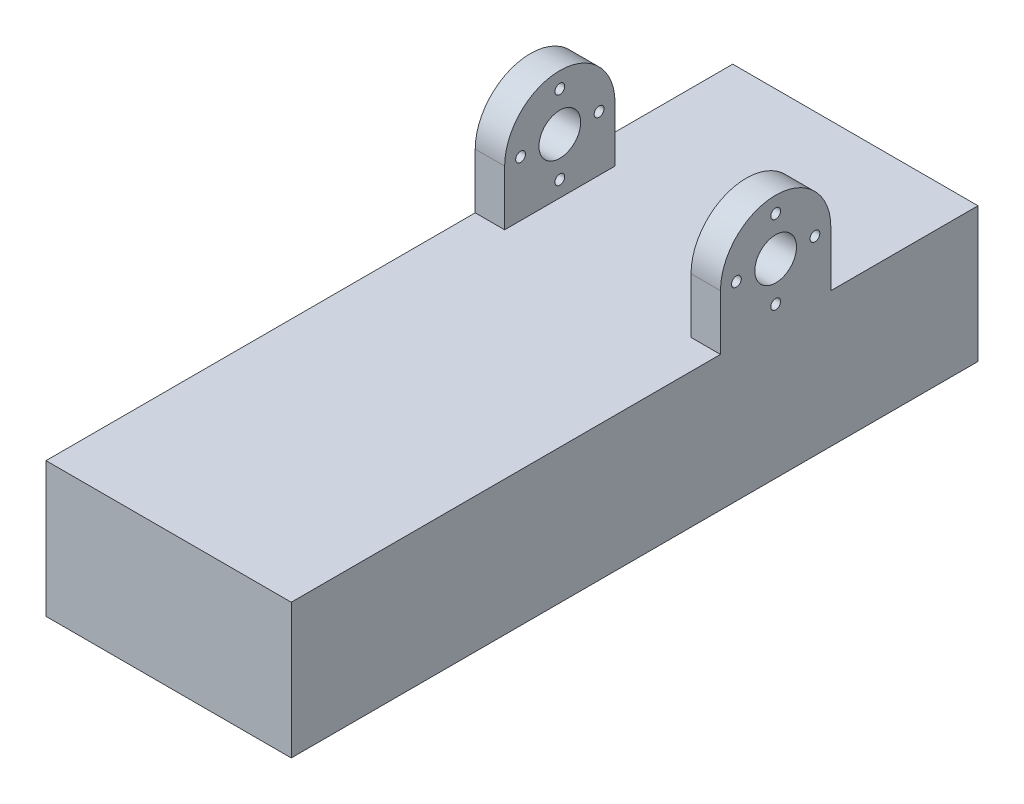
ISO-10303-21;
HEADER;
FILE_DESCRIPTION(('STEP AP214'),'2;1');
FILE_NAME('part.step','',(''),(''),'','','');
FILE_SCHEMA(('AUTOMOTIVE_DESIGN { 1 0 10303 214 1 1 1 1 }'));
ENDSEC;
DATA;
#1=APPLICATION_CONTEXT('core data for automotive mechanical design processes');
#2=APPLICATION_PROTOCOL_DEFINITION('international standard','automotive_design',2000,#1);
#3=PRODUCT_CONTEXT('',#1,'mechanical');
#4=PRODUCT('Part','Part','',(#3));
#5=PRODUCT_RELATED_PRODUCT_CATEGORY('part','',(#4));
#6=PRODUCT_DEFINITION_FORMATION('','',#4);
#7=PRODUCT_DEFINITION_CONTEXT('part definition',#1,'design');
#8=PRODUCT_DEFINITION('design','',#6,#7);
#9=PRODUCT_DEFINITION_SHAPE('','',#8);
#10=(LENGTH_UNIT() NAMED_UNIT(*) SI_UNIT(.MILLI.,.METRE.));
#11=(NAMED_UNIT(*) PLANE_ANGLE_UNIT() SI_UNIT($,.RADIAN.));
#12=(NAMED_UNIT(*) SI_UNIT($,.STERADIAN.) SOLID_ANGLE_UNIT());
#13=UNCERTAINTY_MEASURE_WITH_UNIT(LENGTH_MEASURE(1.E-05),#10,'distance_accuracy_value','');
#14=(GEOMETRIC_REPRESENTATION_CONTEXT(3) GLOBAL_UNCERTAINTY_ASSIGNED_CONTEXT((#13)) GLOBAL_UNIT_ASSIGNED_CONTEXT((#10,
#11,#12)) REPRESENTATION_CONTEXT('',''));
#15=CARTESIAN_POINT('',(0.,0.,0.));
#16=DIRECTION('',(0.,0.,1.));
#17=DIRECTION('',(1.,0.,0.));
#18=AXIS2_PLACEMENT_3D('',#15,#16,#17);
#19=CARTESIAN_POINT('',(-19.,0.,-55.));
#20=DIRECTION('',(-1.,0.,0.));
#21=DIRECTION('',(0.,-1.,0.));
#22=AXIS2_PLACEMENT_3D('',#19,#20,#21);
#23=PLANE('',#22);
#24=CARTESIAN_POINT('',(-19.,-12.75,-27.5));
#25=DIRECTION('',(-1.,0.,0.));
#26=DIRECTION('',(0.,-1.,0.));
#27=AXIS2_PLACEMENT_3D('',#24,#25,#26);
#28=CIRCLE('',#27,4.25);
#29=CARTESIAN_POINT('',(-19.,-17.,-27.5));
#30=VERTEX_POINT('',#29);
#31=EDGE_CURVE('E261',#30,#30,#28,.F.);
#32=ORIENTED_EDGE('',*,*,#31,.F.);
#33=EDGE_LOOP('',(#32));
#34=FACE_BOUND('',#33,.T.);
#35=CARTESIAN_POINT('',(-19.,-12.7499999999999,-35.5000000000001));
#36=DIRECTION('',(-1.,0.,0.));
#37=DIRECTION('',(0.,-1.,0.));
#38=AXIS2_PLACEMENT_3D('',#35,#36,#37);
#39=CIRCLE('',#38,1.00000000000001);
#40=CARTESIAN_POINT('',(-19.,-13.7499999999999,-35.5000000000001));
#41=VERTEX_POINT('',#40);
#42=EDGE_CURVE('E253',#41,#41,#39,.F.);
#43=ORIENTED_EDGE('',*,*,#42,.F.);
#44=EDGE_LOOP('',(#43));
#45=FACE_BOUND('',#44,.T.);
#46=CARTESIAN_POINT('',(-19.,-4.75000000000001,-27.5));
#47=DIRECTION('',(-1.,0.,0.));
#48=DIRECTION('',(0.,-1.,0.));
#49=AXIS2_PLACEMENT_3D('',#46,#47,#48);
#50=CIRCLE('',#49,1.);
#51=CARTESIAN_POINT('',(-19.,-5.75000000000001,-27.5));
#52=VERTEX_POINT('',#51);
#53=EDGE_CURVE('E249',#52,#52,#50,.F.);
#54=ORIENTED_EDGE('',*,*,#53,.F.);
#55=EDGE_LOOP('',(#54));
#56=FACE_BOUND('',#55,.T.);
#57=CARTESIAN_POINT('',(-19.,-20.75,-27.5000000000002));
#58=DIRECTION('',(-1.,0.,0.));
#59=DIRECTION('',(0.,-1.,0.));
#60=AXIS2_PLACEMENT_3D('',#57,#58,#59);
#61=CIRCLE('',#60,1.);
#62=CARTESIAN_POINT('',(-19.,-21.75,-27.5000000000002));
#63=VERTEX_POINT('',#62);
#64=EDGE_CURVE('E257',#63,#63,#61,.F.);
#65=ORIENTED_EDGE('',*,*,#64,.F.);
#66=EDGE_LOOP('',(#65));
#67=FACE_BOUND('',#66,.T.);
#68=CARTESIAN_POINT('',(-19.,-12.75,-19.5000000000001));
#69=DIRECTION('',(-1.,0.,0.));
#70=DIRECTION('',(0.,-1.,0.));
#71=AXIS2_PLACEMENT_3D('',#68,#69,#70);
#72=CIRCLE('',#71,1.);
#73=CARTESIAN_POINT('',(-19.,-13.75,-19.5000000000001));
#74=VERTEX_POINT('',#73);
#75=EDGE_CURVE('E265',#74,#74,#72,.F.);
#76=ORIENTED_EDGE('',*,*,#75,.F.);
#77=EDGE_LOOP('',(#76));
#78=FACE_BOUND('',#77,.T.);
#79=DIRECTION('',(0.,0.,1.));
#80=VECTOR('',#79,1.);
#81=CARTESIAN_POINT('',(-19.,-24.,-55.));
#82=LINE('',#81,#80);
#83=CARTESIAN_POINT('',(-19.,-24.,-38.75));
#84=VERTEX_POINT('',#83);
#85=CARTESIAN_POINT('',(-19.,-24.,-16.25));
#86=VERTEX_POINT('',#85);
#87=EDGE_CURVE('E182',#84,#86,#82,.T.);
#88=ORIENTED_EDGE('',*,*,#87,.F.);
#89=DIRECTION('',(0.,1.,0.));
#90=VECTOR('',#89,1.);
#91=CARTESIAN_POINT('',(-19.,0.,-38.75));
#92=LINE('',#91,#90);
#93=CARTESIAN_POINT('',(-19.,-12.75,-38.75));
#94=VERTEX_POINT('',#93);
#95=EDGE_CURVE('E227',#84,#94,#92,.T.);
#96=ORIENTED_EDGE('',*,*,#95,.T.);
#97=CARTESIAN_POINT('',(-19.,-12.75,-27.5));
#98=DIRECTION('',(-1.,0.,0.));
#99=DIRECTION('',(0.,-1.,0.));
#100=AXIS2_PLACEMENT_3D('',#97,#98,#99);
#101=CIRCLE('',#100,11.25);
#102=CARTESIAN_POINT('',(-19.,-12.75,-16.25));
#103=VERTEX_POINT('',#102);
#104=EDGE_CURVE('E246',#103,#94,#101,.T.);
#105=ORIENTED_EDGE('',*,*,#104,.F.);
#106=DIRECTION('',(0.,1.,0.));
#107=VECTOR('',#106,1.);
#108=CARTESIAN_POINT('',(-19.,0.,-16.25));
#109=LINE('',#108,#107);
#110=EDGE_CURVE('E243',#86,#103,#109,.T.);
#111=ORIENTED_EDGE('',*,*,#110,.F.);
#112=EDGE_LOOP('',(#88,#96,#105,#111));
#113=FACE_BOUND('',#112,.T.);
#114=ADVANCED_FACE('F47',(#34,#45,#56,#67,#78,#113),#23,.F.);
#115=CARTESIAN_POINT('',(19.,0.,-55.));
#116=DIRECTION('',(1.,0.,0.));
#117=DIRECTION('',(0.,1.,0.));
#118=AXIS2_PLACEMENT_3D('',#115,#116,#117);
#119=PLANE('',#118);
#120=CARTESIAN_POINT('',(19.,-12.75,-27.5));
#121=DIRECTION('',(1.,0.,0.));
#122=DIRECTION('',(0.,1.,0.));
#123=AXIS2_PLACEMENT_3D('',#120,#121,#122);
#124=CIRCLE('',#123,4.25);
#125=CARTESIAN_POINT('',(19.,-8.50000000000001,-27.5));
#126=VERTEX_POINT('',#125);
#127=EDGE_CURVE('E281',#126,#126,#124,.F.);
#128=ORIENTED_EDGE('',*,*,#127,.F.);
#129=EDGE_LOOP('',(#128));
#130=FACE_BOUND('',#129,.T.);
#131=CARTESIAN_POINT('',(19.,-12.7499999999999,-35.5000000000001));
#132=DIRECTION('',(1.,0.,0.));
#133=DIRECTION('',(0.,1.,0.));
#134=AXIS2_PLACEMENT_3D('',#131,#132,#133);
#135=CIRCLE('',#134,1.00000000000001);
#136=CARTESIAN_POINT('',(19.,-11.7499999999999,-35.5000000000001));
#137=VERTEX_POINT('',#136);
#138=EDGE_CURVE('E273',#137,#137,#135,.F.);
#139=ORIENTED_EDGE('',*,*,#138,.F.);
#140=EDGE_LOOP('',(#139));
#141=FACE_BOUND('',#140,.T.);
#142=CARTESIAN_POINT('',(19.,-4.75000000000001,-27.5));
#143=DIRECTION('',(1.,0.,0.));
#144=DIRECTION('',(0.,1.,0.));
#145=AXIS2_PLACEMENT_3D('',#142,#143,#144);
#146=CIRCLE('',#145,1.);
#147=CARTESIAN_POINT('',(19.,-3.75000000000001,-27.5));
#148=VERTEX_POINT('',#147);
#149=EDGE_CURVE('E269',#148,#148,#146,.F.);
#150=ORIENTED_EDGE('',*,*,#149,.F.);
#151=EDGE_LOOP('',(#150));
#152=FACE_BOUND('',#151,.T.);
#153=CARTESIAN_POINT('',(19.,-20.75,-27.5000000000002));
#154=DIRECTION('',(1.,0.,0.));
#155=DIRECTION('',(0.,1.,0.));
#156=AXIS2_PLACEMENT_3D('',#153,#154,#155);
#157=CIRCLE('',#156,1.);
#158=CARTESIAN_POINT('',(19.,-19.75,-27.5000000000002));
#159=VERTEX_POINT('',#158);
#160=EDGE_CURVE('E277',#159,#159,#157,.F.);
#161=ORIENTED_EDGE('',*,*,#160,.F.);
#162=EDGE_LOOP('',(#161));
#163=FACE_BOUND('',#162,.T.);
#164=CARTESIAN_POINT('',(19.,-12.75,-19.5000000000001));
#165=DIRECTION('',(1.,0.,0.));
#166=DIRECTION('',(0.,1.,0.));
#167=AXIS2_PLACEMENT_3D('',#164,#165,#166);
#168=CIRCLE('',#167,1.);
#169=CARTESIAN_POINT('',(19.,-11.75,-19.5000000000001));
#170=VERTEX_POINT('',#169);
#171=EDGE_CURVE('E285',#170,#170,#168,.F.);
#172=ORIENTED_EDGE('',*,*,#171,.F.);
#173=EDGE_LOOP('',(#172));
#174=FACE_BOUND('',#173,.T.);
#175=DIRECTION('',(0.,0.,-1.));
#176=VECTOR('',#175,1.);
#177=CARTESIAN_POINT('',(19.,-24.,-55.));
#178=LINE('',#177,#176);
#179=CARTESIAN_POINT('',(19.,-24.,-16.25));
#180=VERTEX_POINT('',#179);
#181=CARTESIAN_POINT('',(19.,-24.,-38.75));
#182=VERTEX_POINT('',#181);
#183=EDGE_CURVE('E192',#180,#182,#178,.T.);
#184=ORIENTED_EDGE('',*,*,#183,.F.);
#185=DIRECTION('',(0.,-1.,0.));
#186=VECTOR('',#185,1.);
#187=CARTESIAN_POINT('',(19.,0.,-16.25));
#188=LINE('',#187,#186);
#189=CARTESIAN_POINT('',(19.,-12.75,-16.25));
#190=VERTEX_POINT('',#189);
#191=EDGE_CURVE('E11',#190,#180,#188,.T.);
#192=ORIENTED_EDGE('',*,*,#191,.F.);
#193=CARTESIAN_POINT('',(19.,-12.75,-27.5));
#194=DIRECTION('',(1.,0.,0.));
#195=DIRECTION('',(0.,1.,0.));
#196=AXIS2_PLACEMENT_3D('',#193,#194,#195);
#197=CIRCLE('',#196,11.25);
#198=CARTESIAN_POINT('',(19.,-12.75,-38.75));
#199=VERTEX_POINT('',#198);
#200=EDGE_CURVE('E56',#199,#190,#197,.T.);
#201=ORIENTED_EDGE('',*,*,#200,.F.);
#202=DIRECTION('',(0.,-1.,0.));
#203=VECTOR('',#202,1.);
#204=CARTESIAN_POINT('',(19.,0.,-38.75));
#205=LINE('',#204,#203);
#206=EDGE_CURVE('E150',#199,#182,#205,.T.);
#207=ORIENTED_EDGE('',*,*,#206,.T.);
#208=EDGE_LOOP('',(#184,#192,#201,#207));
#209=FACE_BOUND('',#208,.T.);
#210=ADVANCED_FACE('F357',(#130,#141,#152,#163,#174,#209),#119,.F.);
#211=CARTESIAN_POINT('',(-25.,0.,-55.));
#212=DIRECTION('',(-1.,0.,0.));
#213=DIRECTION('',(0.,-1.,0.));
#214=AXIS2_PLACEMENT_3D('',#211,#212,#213);
#215=PLANE('',#214);
#216=DIRECTION('',(0.,0.,1.));
#217=VECTOR('',#216,1.);
#218=CARTESIAN_POINT('',(-25.,-24.,0.));
#219=LINE('',#218,#217);
#220=CARTESIAN_POINT('',(-25.0000000000001,-24.,-16.25));
#221=VERTEX_POINT('',#220);
#222=CARTESIAN_POINT('',(-25.,-24.,71.25));
#223=VERTEX_POINT('',#222);
#224=EDGE_CURVE('E292',#221,#223,#219,.T.);
#225=ORIENTED_EDGE('',*,*,#224,.F.);
#226=DIRECTION('',(0.,-1.,0.));
#227=VECTOR('',#226,1.);
#228=CARTESIAN_POINT('',(-25.0000000000001,0.,-16.25));
#229=LINE('',#228,#227);
#230=CARTESIAN_POINT('',(-25.0000000000001,-12.75,-16.25));
#231=VERTEX_POINT('',#230);
#232=EDGE_CURVE('E208',#231,#221,#229,.T.);
#233=ORIENTED_EDGE('',*,*,#232,.F.);
#234=CARTESIAN_POINT('',(-25.0000000000001,-12.75,-27.5));
#235=DIRECTION('',(1.,0.,0.));
#236=DIRECTION('',(0.,1.,0.));
#237=AXIS2_PLACEMENT_3D('',#234,#235,#236);
#238=CIRCLE('',#237,11.25);
#239=CARTESIAN_POINT('',(-25.0000000000001,-12.75,-38.75));
#240=VERTEX_POINT('',#239);
#241=EDGE_CURVE('E202',#240,#231,#238,.T.);
#242=ORIENTED_EDGE('',*,*,#241,.F.);
#243=DIRECTION('',(0.,-1.,0.));
#244=VECTOR('',#243,1.);
#245=CARTESIAN_POINT('',(-25.0000000000001,0.,-38.75));
#246=LINE('',#245,#244);
#247=CARTESIAN_POINT('',(-25.0000000000001,-24.,-38.75));
#248=VERTEX_POINT('',#247);
#249=EDGE_CURVE('E145',#240,#248,#246,.T.);
#250=ORIENTED_EDGE('',*,*,#249,.T.);
#251=DIRECTION('',(0.,0.,1.));
#252=VECTOR('',#251,1.);
#253=CARTESIAN_POINT('',(-25.,-24.,0.));
#254=LINE('',#253,#252);
#255=CARTESIAN_POINT('',(-25.,-24.,-68.75));
#256=VERTEX_POINT('',#255);
#257=EDGE_CURVE('E138',#256,#248,#254,.T.);
#258=ORIENTED_EDGE('',*,*,#257,.F.);
#259=DIRECTION('',(0.,-1.,0.));
#260=VECTOR('',#259,1.);
#261=CARTESIAN_POINT('',(-25.,0.,-68.75));
#262=LINE('',#261,#260);
#263=CARTESIAN_POINT('',(-25.,-51.5,-68.75));
#264=VERTEX_POINT('',#263);
#265=EDGE_CURVE('E142',#256,#264,#262,.T.);
#266=ORIENTED_EDGE('',*,*,#265,.T.);
#267=DIRECTION('',(0.,0.,-1.));
#268=VECTOR('',#267,1.);
#269=CARTESIAN_POINT('',(-25.0000000000001,-51.5,0.));
#270=LINE('',#269,#268);
#271=CARTESIAN_POINT('',(-25.,-51.5,71.25));
#272=VERTEX_POINT('',#271);
#273=EDGE_CURVE('E196',#272,#264,#270,.T.);
#274=ORIENTED_EDGE('',*,*,#273,.F.);
#275=DIRECTION('',(0.,-1.,0.));
#276=VECTOR('',#275,1.);
#277=CARTESIAN_POINT('',(-25.,0.,71.25));
#278=LINE('',#277,#276);
#279=EDGE_CURVE('E162',#223,#272,#278,.T.);
#280=ORIENTED_EDGE('',*,*,#279,.F.);
#281=EDGE_LOOP('',(#225,#233,#242,#250,#258,#266,#274,#280));
#282=FACE_BOUND('',#281,.T.);
#283=CARTESIAN_POINT('',(-25.,-12.75,-19.5000000000001));
#284=DIRECTION('',(1.,0.,0.));
#285=DIRECTION('',(0.,1.,0.));
#286=AXIS2_PLACEMENT_3D('',#283,#284,#285);
#287=CIRCLE('',#286,1.);
#288=CARTESIAN_POINT('',(-25.,-11.75,-19.5000000000001));
#289=VERTEX_POINT('',#288);
#290=EDGE_CURVE('E314',#289,#289,#287,.T.);
#291=ORIENTED_EDGE('',*,*,#290,.T.);
#292=EDGE_LOOP('',(#291));
#293=FACE_BOUND('',#292,.T.);
#294=CARTESIAN_POINT('',(-25.,-12.75,-27.5));
#295=DIRECTION('',(1.,0.,0.));
#296=DIRECTION('',(0.,1.,0.));
#297=AXIS2_PLACEMENT_3D('',#294,#295,#296);
#298=CIRCLE('',#297,4.25);
#299=CARTESIAN_POINT('',(-25.,-8.50000000000001,-27.5));
#300=VERTEX_POINT('',#299);
#301=EDGE_CURVE('E322',#300,#300,#298,.T.);
#302=ORIENTED_EDGE('',*,*,#301,.T.);
#303=EDGE_LOOP('',(#302));
#304=FACE_BOUND('',#303,.T.);
#305=CARTESIAN_POINT('',(-25.,-20.75,-27.5000000000002));
#306=DIRECTION('',(1.,0.,0.));
#307=DIRECTION('',(0.,1.,0.));
#308=AXIS2_PLACEMENT_3D('',#305,#306,#307);
#309=CIRCLE('',#308,1.);
#310=CARTESIAN_POINT('',(-25.,-19.75,-27.5000000000002));
#311=VERTEX_POINT('',#310);
#312=EDGE_CURVE('E330',#311,#311,#309,.T.);
#313=ORIENTED_EDGE('',*,*,#312,.T.);
#314=EDGE_LOOP('',(#313));
#315=FACE_BOUND('',#314,.T.);
#316=CARTESIAN_POINT('',(-25.,-12.7499999999999,-35.5000000000001));
#317=DIRECTION('',(1.,0.,0.));
#318=DIRECTION('',(0.,1.,0.));
#319=AXIS2_PLACEMENT_3D('',#316,#317,#318);
#320=CIRCLE('',#319,1.00000000000001);
#321=CARTESIAN_POINT('',(-25.,-11.7499999999999,-35.5000000000001));
#322=VERTEX_POINT('',#321);
#323=EDGE_CURVE('E293',#322,#322,#320,.T.);
#324=ORIENTED_EDGE('',*,*,#323,.T.);
#325=EDGE_LOOP('',(#324));
#326=FACE_BOUND('',#325,.T.);
#327=CARTESIAN_POINT('',(-25.,-4.75000000000001,-27.5));
#328=DIRECTION('',(1.,0.,0.));
#329=DIRECTION('',(0.,1.,0.));
#330=AXIS2_PLACEMENT_3D('',#327,#328,#329);
#331=CIRCLE('',#330,1.);
#332=CARTESIAN_POINT('',(-25.,-3.75000000000001,-27.5));
#333=VERTEX_POINT('',#332);
#334=EDGE_CURVE('E302',#333,#333,#331,.T.);
#335=ORIENTED_EDGE('',*,*,#334,.T.);
#336=EDGE_LOOP('',(#335));
#337=FACE_BOUND('',#336,.T.);
#338=ADVANCED_FACE('F49',(#282,#293,#304,#315,#326,#337),#215,.T.);
#339=CARTESIAN_POINT('',(25.,0.,-55.));
#340=DIRECTION('',(1.,0.,0.));
#341=DIRECTION('',(0.,1.,0.));
#342=AXIS2_PLACEMENT_3D('',#339,#340,#341);
#343=PLANE('',#342);
#344=DIRECTION('',(0.,0.,1.));
#345=VECTOR('',#344,1.);
#346=CARTESIAN_POINT('',(25.,-24.,0.));
#347=LINE('',#346,#345);
#348=CARTESIAN_POINT('',(25.,-24.,-68.75));
#349=VERTEX_POINT('',#348);
#350=CARTESIAN_POINT('',(25.,-24.,-38.75));
#351=VERTEX_POINT('',#350);
#352=EDGE_CURVE('E151',#349,#351,#347,.T.);
#353=ORIENTED_EDGE('',*,*,#352,.T.);
#354=DIRECTION('',(0.,-1.,0.));
#355=VECTOR('',#354,1.);
#356=CARTESIAN_POINT('',(25.,0.,-38.75));
#357=LINE('',#356,#355);
#358=CARTESIAN_POINT('',(25.,-12.75,-38.75));
#359=VERTEX_POINT('',#358);
#360=EDGE_CURVE('E216',#359,#351,#357,.T.);
#361=ORIENTED_EDGE('',*,*,#360,.F.);
#362=CARTESIAN_POINT('',(25.,-12.75,-27.5));
#363=DIRECTION('',(1.,0.,0.));
#364=DIRECTION('',(0.,1.,0.));
#365=AXIS2_PLACEMENT_3D('',#362,#363,#364);
#366=CIRCLE('',#365,11.25);
#367=CARTESIAN_POINT('',(25.,-12.75,-16.25));
#368=VERTEX_POINT('',#367);
#369=EDGE_CURVE('E199',#359,#368,#366,.T.);
#370=ORIENTED_EDGE('',*,*,#369,.T.);
#371=DIRECTION('',(0.,-1.,0.));
#372=VECTOR('',#371,1.);
#373=CARTESIAN_POINT('',(25.,0.,-16.25));
#374=LINE('',#373,#372);
#375=CARTESIAN_POINT('',(25.,-24.,-16.25));
#376=VERTEX_POINT('',#375);
#377=EDGE_CURVE('E205',#368,#376,#374,.T.);
#378=ORIENTED_EDGE('',*,*,#377,.T.);
#379=DIRECTION('',(0.,0.,1.));
#380=VECTOR('',#379,1.);
#381=CARTESIAN_POINT('',(25.,-24.,0.));
#382=LINE('',#381,#380);
#383=CARTESIAN_POINT('',(25.,-24.,71.25));
#384=VERTEX_POINT('',#383);
#385=EDGE_CURVE('E311',#376,#384,#382,.T.);
#386=ORIENTED_EDGE('',*,*,#385,.T.);
#387=DIRECTION('',(0.,-1.,0.));
#388=VECTOR('',#387,1.);
#389=CARTESIAN_POINT('',(25.,0.,71.25));
#390=LINE('',#389,#388);
#391=CARTESIAN_POINT('',(25.,-51.5,71.25));
#392=VERTEX_POINT('',#391);
#393=EDGE_CURVE('E168',#384,#392,#390,.T.);
#394=ORIENTED_EDGE('',*,*,#393,.T.);
#395=DIRECTION('',(0.,0.,-1.));
#396=VECTOR('',#395,1.);
#397=CARTESIAN_POINT('',(25.,-51.5,0.));
#398=LINE('',#397,#396);
#399=CARTESIAN_POINT('',(25.,-51.5,-68.75));
#400=VERTEX_POINT('',#399);
#401=EDGE_CURVE('E195',#392,#400,#398,.T.);
#402=ORIENTED_EDGE('',*,*,#401,.T.);
#403=DIRECTION('',(0.,-1.,0.));
#404=VECTOR('',#403,1.);
#405=CARTESIAN_POINT('',(25.,0.,-68.75));
#406=LINE('',#405,#404);
#407=EDGE_CURVE('E175',#349,#400,#406,.T.);
#408=ORIENTED_EDGE('',*,*,#407,.F.);
#409=EDGE_LOOP('',(#353,#361,#370,#378,#386,#394,#402,#408));
#410=FACE_BOUND('',#409,.T.);
#411=CARTESIAN_POINT('',(25.,-12.75,-19.5000000000001));
#412=DIRECTION('',(1.,0.,0.));
#413=DIRECTION('',(0.,1.,0.));
#414=AXIS2_PLACEMENT_3D('',#411,#412,#413);
#415=CIRCLE('',#414,1.);
#416=CARTESIAN_POINT('',(25.,-11.75,-19.5000000000001));
#417=VERTEX_POINT('',#416);
#418=EDGE_CURVE('E318',#417,#417,#415,.T.);
#419=ORIENTED_EDGE('',*,*,#418,.F.);
#420=EDGE_LOOP('',(#419));
#421=FACE_BOUND('',#420,.T.);
#422=CARTESIAN_POINT('',(25.,-12.75,-27.5));
#423=DIRECTION('',(1.,0.,0.));
#424=DIRECTION('',(0.,1.,0.));
#425=AXIS2_PLACEMENT_3D('',#422,#423,#424);
#426=CIRCLE('',#425,4.25);
#427=CARTESIAN_POINT('',(25.,-8.50000000000001,-27.5));
#428=VERTEX_POINT('',#427);
#429=EDGE_CURVE('E326',#428,#428,#426,.T.);
#430=ORIENTED_EDGE('',*,*,#429,.F.);
#431=EDGE_LOOP('',(#430));
#432=FACE_BOUND('',#431,.T.);
#433=CARTESIAN_POINT('',(25.,-20.75,-27.5000000000002));
#434=DIRECTION('',(1.,0.,0.));
#435=DIRECTION('',(0.,1.,0.));
#436=AXIS2_PLACEMENT_3D('',#433,#434,#435);
#437=CIRCLE('',#436,1.);
#438=CARTESIAN_POINT('',(25.,-19.75,-27.5000000000002));
#439=VERTEX_POINT('',#438);
#440=EDGE_CURVE('E297',#439,#439,#437,.T.);
#441=ORIENTED_EDGE('',*,*,#440,.F.);
#442=EDGE_LOOP('',(#441));
#443=FACE_BOUND('',#442,.T.);
#444=CARTESIAN_POINT('',(25.,-12.7499999999999,-35.5000000000001));
#445=DIRECTION('',(1.,0.,0.));
#446=DIRECTION('',(0.,1.,0.));
#447=AXIS2_PLACEMENT_3D('',#444,#445,#446);
#448=CIRCLE('',#447,1.00000000000001);
#449=CARTESIAN_POINT('',(25.,-11.7499999999999,-35.5000000000001));
#450=VERTEX_POINT('',#449);
#451=EDGE_CURVE('E298',#450,#450,#448,.T.);
#452=ORIENTED_EDGE('',*,*,#451,.F.);
#453=EDGE_LOOP('',(#452));
#454=FACE_BOUND('',#453,.T.);
#455=CARTESIAN_POINT('',(25.,-4.75000000000001,-27.5));
#456=DIRECTION('',(1.,0.,0.));
#457=DIRECTION('',(0.,1.,0.));
#458=AXIS2_PLACEMENT_3D('',#455,#456,#457);
#459=CIRCLE('',#458,1.);
#460=CARTESIAN_POINT('',(25.,-3.75,-27.5));
#461=VERTEX_POINT('',#460);
#462=EDGE_CURVE('E288',#461,#461,#459,.T.);
#463=ORIENTED_EDGE('',*,*,#462,.F.);
#464=EDGE_LOOP('',(#463));
#465=FACE_BOUND('',#464,.T.);
#466=ADVANCED_FACE('F353',(#410,#421,#432,#443,#454,#465),#343,.T.);
#467=CARTESIAN_POINT('',(-25.,-12.75,-19.5000000000001));
#468=DIRECTION('',(1.,0.,0.));
#469=DIRECTION('',(0.,1.,0.));
#470=AXIS2_PLACEMENT_3D('',#467,#468,#469);
#471=CYLINDRICAL_SURFACE('',#470,1.);
#472=ORIENTED_EDGE('',*,*,#171,.T.);
#473=EDGE_LOOP('',(#472));
#474=FACE_BOUND('',#473,.T.);
#475=ORIENTED_EDGE('',*,*,#418,.T.);
#476=EDGE_LOOP('',(#475));
#477=FACE_BOUND('',#476,.T.);
#478=ADVANCED_FACE('F417',(#474,#477),#471,.F.);
#479=CARTESIAN_POINT('',(-25.,-12.75,-27.5));
#480=DIRECTION('',(1.,0.,0.));
#481=DIRECTION('',(0.,1.,0.));
#482=AXIS2_PLACEMENT_3D('',#479,#480,#481);
#483=CYLINDRICAL_SURFACE('',#482,4.25);
#484=ORIENTED_EDGE('',*,*,#127,.T.);
#485=EDGE_LOOP('',(#484));
#486=FACE_BOUND('',#485,.T.);
#487=ORIENTED_EDGE('',*,*,#429,.T.);
#488=EDGE_LOOP('',(#487));
#489=FACE_BOUND('',#488,.T.);
#490=ADVANCED_FACE('F421',(#486,#489),#483,.F.);
#491=CARTESIAN_POINT('',(-25.,-20.75,-27.5000000000002));
#492=DIRECTION('',(1.,0.,0.));
#493=DIRECTION('',(0.,1.,0.));
#494=AXIS2_PLACEMENT_3D('',#491,#492,#493);
#495=CYLINDRICAL_SURFACE('',#494,1.);
#496=ORIENTED_EDGE('',*,*,#160,.T.);
#497=EDGE_LOOP('',(#496));
#498=FACE_BOUND('',#497,.T.);
#499=ORIENTED_EDGE('',*,*,#440,.T.);
#500=EDGE_LOOP('',(#499));
#501=FACE_BOUND('',#500,.T.);
#502=ADVANCED_FACE('F424',(#498,#501),#495,.F.);
#503=CARTESIAN_POINT('',(-25.,-12.7499999999999,-35.5000000000001));
#504=DIRECTION('',(1.,0.,0.));
#505=DIRECTION('',(0.,1.,0.));
#506=AXIS2_PLACEMENT_3D('',#503,#504,#505);
#507=CYLINDRICAL_SURFACE('',#506,1.00000000000001);
#508=ORIENTED_EDGE('',*,*,#138,.T.);
#509=EDGE_LOOP('',(#508));
#510=FACE_BOUND('',#509,.T.);
#511=ORIENTED_EDGE('',*,*,#451,.T.);
#512=EDGE_LOOP('',(#511));
#513=FACE_BOUND('',#512,.T.);
#514=ADVANCED_FACE('F407',(#510,#513),#507,.F.);
#515=CARTESIAN_POINT('',(-25.,-4.75000000000001,-27.5));
#516=DIRECTION('',(1.,0.,0.));
#517=DIRECTION('',(0.,1.,0.));
#518=AXIS2_PLACEMENT_3D('',#515,#516,#517);
#519=CYLINDRICAL_SURFACE('',#518,1.);
#520=ORIENTED_EDGE('',*,*,#149,.T.);
#521=EDGE_LOOP('',(#520));
#522=FACE_BOUND('',#521,.T.);
#523=ORIENTED_EDGE('',*,*,#462,.T.);
#524=EDGE_LOOP('',(#523));
#525=FACE_BOUND('',#524,.T.);
#526=ADVANCED_FACE('F411',(#522,#525),#519,.F.);
#527=ORIENTED_EDGE('',*,*,#75,.T.);
#528=EDGE_LOOP('',(#527));
#529=FACE_BOUND('',#528,.T.);
#530=ORIENTED_EDGE('',*,*,#290,.F.);
#531=EDGE_LOOP('',(#530));
#532=FACE_BOUND('',#531,.T.);
#533=ADVANCED_FACE('F412',(#529,#532),#471,.F.);
#534=ORIENTED_EDGE('',*,*,#31,.T.);
#535=EDGE_LOOP('',(#534));
#536=FACE_BOUND('',#535,.T.);
#537=ORIENTED_EDGE('',*,*,#301,.F.);
#538=EDGE_LOOP('',(#537));
#539=FACE_BOUND('',#538,.T.);
#540=ADVANCED_FACE('F415',(#536,#539),#483,.F.);
#541=ORIENTED_EDGE('',*,*,#64,.T.);
#542=EDGE_LOOP('',(#541));
#543=FACE_BOUND('',#542,.T.);
#544=ORIENTED_EDGE('',*,*,#312,.F.);
#545=EDGE_LOOP('',(#544));
#546=FACE_BOUND('',#545,.T.);
#547=ADVANCED_FACE('F405',(#543,#546),#495,.F.);
#548=ORIENTED_EDGE('',*,*,#42,.T.);
#549=EDGE_LOOP('',(#548));
#550=FACE_BOUND('',#549,.T.);
#551=ORIENTED_EDGE('',*,*,#323,.F.);
#552=EDGE_LOOP('',(#551));
#553=FACE_BOUND('',#552,.T.);
#554=ADVANCED_FACE('F402',(#550,#553),#507,.F.);
#555=ORIENTED_EDGE('',*,*,#53,.T.);
#556=EDGE_LOOP('',(#555));
#557=FACE_BOUND('',#556,.T.);
#558=ORIENTED_EDGE('',*,*,#334,.F.);
#559=EDGE_LOOP('',(#558));
#560=FACE_BOUND('',#559,.T.);
#561=ADVANCED_FACE('F401',(#557,#560),#519,.F.);
#562=CARTESIAN_POINT('',(-25.,-24.,0.));
#563=DIRECTION('',(0.,1.,0.));
#564=DIRECTION('',(0.,0.,1.));
#565=AXIS2_PLACEMENT_3D('',#562,#563,#564);
#566=PLANE('',#565);
#567=ORIENTED_EDGE('',*,*,#352,.F.);
#568=DIRECTION('',(1.,0.,0.));
#569=VECTOR('',#568,1.);
#570=CARTESIAN_POINT('',(-25.,-24.,-68.75));
#571=LINE('',#570,#569);
#572=EDGE_CURVE('E154',#256,#349,#571,.T.);
#573=ORIENTED_EDGE('',*,*,#572,.F.);
#574=ORIENTED_EDGE('',*,*,#257,.T.);
#575=DIRECTION('',(1.,0.,0.));
#576=VECTOR('',#575,1.);
#577=CARTESIAN_POINT('',(-25.0000000000001,-24.,-38.75));
#578=LINE('',#577,#576);
#579=EDGE_CURVE('E234',#248,#84,#578,.T.);
#580=ORIENTED_EDGE('',*,*,#579,.T.);
#581=ORIENTED_EDGE('',*,*,#87,.T.);
#582=DIRECTION('',(1.,0.,0.));
#583=VECTOR('',#582,1.);
#584=CARTESIAN_POINT('',(-25.0000000000001,-24.,-16.25));
#585=LINE('',#584,#583);
#586=EDGE_CURVE('E229',#221,#86,#585,.T.);
#587=ORIENTED_EDGE('',*,*,#586,.F.);
#588=ORIENTED_EDGE('',*,*,#224,.T.);
#589=DIRECTION('',(1.,0.,0.));
#590=VECTOR('',#589,1.);
#591=CARTESIAN_POINT('',(-25.,-24.,71.25));
#592=LINE('',#591,#590);
#593=EDGE_CURVE('E161',#223,#384,#592,.T.);
#594=ORIENTED_EDGE('',*,*,#593,.T.);
#595=ORIENTED_EDGE('',*,*,#385,.F.);
#596=EDGE_CURVE('E233',#180,#376,#585,.T.);
#597=ORIENTED_EDGE('',*,*,#596,.F.);
#598=ORIENTED_EDGE('',*,*,#183,.T.);
#599=EDGE_CURVE('E237',#182,#351,#578,.T.);
#600=ORIENTED_EDGE('',*,*,#599,.T.);
#601=EDGE_LOOP('',(#567,#573,#574,#580,#581,#587,#588,#594,#595,#597,#598,#600));
#602=FACE_BOUND('',#601,.T.);
#603=ADVANCED_FACE('F155',(#602),#566,.T.);
#604=CARTESIAN_POINT('',(-25.0000000000001,0.,-16.25));
#605=DIRECTION('',(0.,0.,1.));
#606=DIRECTION('',(1.,0.,0.));
#607=AXIS2_PLACEMENT_3D('',#604,#605,#606);
#608=PLANE('',#607);
#609=ORIENTED_EDGE('',*,*,#191,.T.);
#610=ORIENTED_EDGE('',*,*,#596,.T.);
#611=ORIENTED_EDGE('',*,*,#377,.F.);
#612=DIRECTION('',(1.,0.,0.));
#613=VECTOR('',#612,1.);
#614=CARTESIAN_POINT('',(-25.0000000000001,-12.75,-16.25));
#615=LINE('',#614,#613);
#616=EDGE_CURVE('E228',#190,#368,#615,.T.);
#617=ORIENTED_EDGE('',*,*,#616,.F.);
#618=EDGE_LOOP('',(#609,#610,#611,#617));
#619=FACE_BOUND('',#618,.T.);
#620=ADVANCED_FACE('F360',(#619),#608,.T.);
#621=CARTESIAN_POINT('',(-25.0000000000001,0.,-38.75));
#622=DIRECTION('',(0.,0.,1.));
#623=DIRECTION('',(1.,0.,0.));
#624=AXIS2_PLACEMENT_3D('',#621,#622,#623);
#625=PLANE('',#624);
#626=DIRECTION('',(1.,0.,0.));
#627=VECTOR('',#626,1.);
#628=CARTESIAN_POINT('',(-25.0000000000001,-12.75,-38.75));
#629=LINE('',#628,#627);
#630=EDGE_CURVE('E212',#199,#359,#629,.T.);
#631=ORIENTED_EDGE('',*,*,#630,.T.);
#632=ORIENTED_EDGE('',*,*,#360,.T.);
#633=ORIENTED_EDGE('',*,*,#599,.F.);
#634=ORIENTED_EDGE('',*,*,#206,.F.);
#635=EDGE_LOOP('',(#631,#632,#633,#634));
#636=FACE_BOUND('',#635,.T.);
#637=ADVANCED_FACE('F347',(#636),#625,.F.);
#638=CARTESIAN_POINT('',(-25.0000000000001,-12.75,-27.5));
#639=DIRECTION('',(1.,0.,0.));
#640=DIRECTION('',(0.,1.,0.));
#641=AXIS2_PLACEMENT_3D('',#638,#639,#640);
#642=CYLINDRICAL_SURFACE('',#641,11.25);
#643=ORIENTED_EDGE('',*,*,#200,.T.);
#644=ORIENTED_EDGE('',*,*,#616,.T.);
#645=ORIENTED_EDGE('',*,*,#369,.F.);
#646=ORIENTED_EDGE('',*,*,#630,.F.);
#647=EDGE_LOOP('',(#643,#644,#645,#646));
#648=FACE_BOUND('',#647,.T.);
#649=ADVANCED_FACE('F350',(#648),#642,.T.);
#650=ORIENTED_EDGE('',*,*,#104,.T.);
#651=EDGE_CURVE('E63',#240,#94,#629,.T.);
#652=ORIENTED_EDGE('',*,*,#651,.F.);
#653=ORIENTED_EDGE('',*,*,#241,.T.);
#654=EDGE_CURVE('E223',#231,#103,#615,.T.);
#655=ORIENTED_EDGE('',*,*,#654,.T.);
#656=EDGE_LOOP('',(#650,#652,#653,#655));
#657=FACE_BOUND('',#656,.T.);
#658=ADVANCED_FACE('F379',(#657),#642,.T.);
#659=ORIENTED_EDGE('',*,*,#110,.T.);
#660=ORIENTED_EDGE('',*,*,#654,.F.);
#661=ORIENTED_EDGE('',*,*,#232,.T.);
#662=ORIENTED_EDGE('',*,*,#586,.T.);
#663=EDGE_LOOP('',(#659,#660,#661,#662));
#664=FACE_BOUND('',#663,.T.);
#665=ADVANCED_FACE('F373',(#664),#608,.T.);
#666=ORIENTED_EDGE('',*,*,#579,.F.);
#667=ORIENTED_EDGE('',*,*,#249,.F.);
#668=ORIENTED_EDGE('',*,*,#651,.T.);
#669=ORIENTED_EDGE('',*,*,#95,.F.);
#670=EDGE_LOOP('',(#666,#667,#668,#669));
#671=FACE_BOUND('',#670,.T.);
#672=ADVANCED_FACE('F377',(#671),#625,.F.);
#673=CARTESIAN_POINT('',(-25.0000000000001,-51.5,0.));
#674=DIRECTION('',(0.,-1.,0.));
#675=DIRECTION('',(1.,0.,0.));
#676=AXIS2_PLACEMENT_3D('',#673,#674,#675);
#677=PLANE('',#676);
#678=ORIENTED_EDGE('',*,*,#401,.F.);
#679=DIRECTION('',(1.,0.,0.));
#680=VECTOR('',#679,1.);
#681=CARTESIAN_POINT('',(-25.,-51.5,71.25));
#682=LINE('',#681,#680);
#683=EDGE_CURVE('E183',#272,#392,#682,.T.);
#684=ORIENTED_EDGE('',*,*,#683,.F.);
#685=ORIENTED_EDGE('',*,*,#273,.T.);
#686=DIRECTION('',(1.,0.,0.));
#687=VECTOR('',#686,1.);
#688=CARTESIAN_POINT('',(-25.,-51.5,-68.75));
#689=LINE('',#688,#687);
#690=EDGE_CURVE('E166',#264,#400,#689,.T.);
#691=ORIENTED_EDGE('',*,*,#690,.T.);
#692=EDGE_LOOP('',(#678,#684,#685,#691));
#693=FACE_BOUND('',#692,.T.);
#694=ADVANCED_FACE('F368',(#693),#677,.T.);
#695=CARTESIAN_POINT('',(-25.,0.,-68.75));
#696=DIRECTION('',(0.,0.,1.));
#697=DIRECTION('',(1.,0.,0.));
#698=AXIS2_PLACEMENT_3D('',#695,#696,#697);
#699=PLANE('',#698);
#700=ORIENTED_EDGE('',*,*,#407,.T.);
#701=ORIENTED_EDGE('',*,*,#690,.F.);
#702=ORIENTED_EDGE('',*,*,#265,.F.);
#703=ORIENTED_EDGE('',*,*,#572,.T.);
#704=EDGE_LOOP('',(#700,#701,#702,#703));
#705=FACE_BOUND('',#704,.T.);
#706=ADVANCED_FACE('F164',(#705),#699,.F.);
#707=CARTESIAN_POINT('',(-25.,0.,71.25));
#708=DIRECTION('',(0.,0.,1.));
#709=DIRECTION('',(1.,0.,0.));
#710=AXIS2_PLACEMENT_3D('',#707,#708,#709);
#711=PLANE('',#710);
#712=ORIENTED_EDGE('',*,*,#393,.F.);
#713=ORIENTED_EDGE('',*,*,#593,.F.);
#714=ORIENTED_EDGE('',*,*,#279,.T.);
#715=ORIENTED_EDGE('',*,*,#683,.T.);
#716=EDGE_LOOP('',(#712,#713,#714,#715));
#717=FACE_BOUND('',#716,.T.);
#718=ADVANCED_FACE('F364',(#717),#711,.T.);
#719=CLOSED_SHELL('',(#114,#210,#338,#466,#478,#490,#502,#514,#526,#533,#540,#547,#554,#561,
#603,#620,#637,#649,#658,#665,#672,#694,#706,#718));
#720=MANIFOLD_SOLID_BREP('B2',#719);
#721=ADVANCED_BREP_SHAPE_REPRESENTATION('',(#18,#720),#14);
#722=SHAPE_DEFINITION_REPRESENTATION(#9,#721);
ENDSEC;
END-ISO-10303-21;
